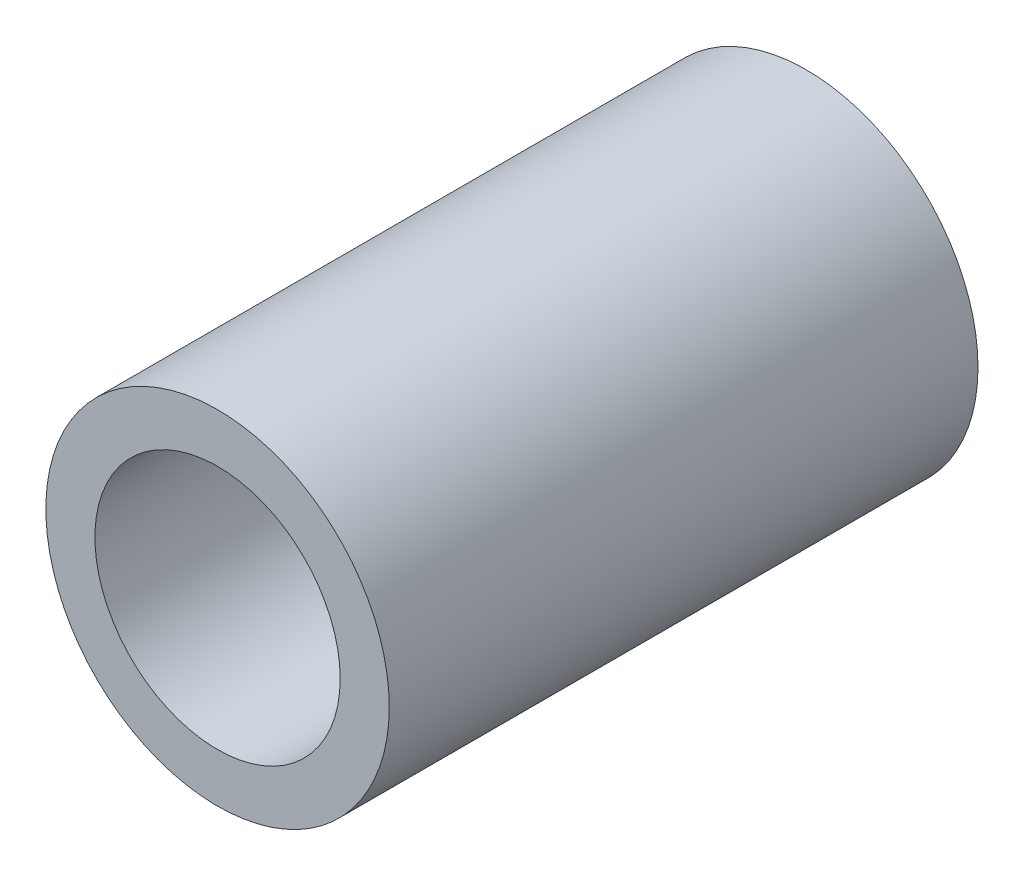
ISO-10303-21;
HEADER;
FILE_DESCRIPTION(('STEP AP214'),'2;1');
FILE_NAME('part.step','',(''),(''),'','','');
FILE_SCHEMA(('AUTOMOTIVE_DESIGN { 1 0 10303 214 1 1 1 1 }'));
ENDSEC;
DATA;
#1=APPLICATION_CONTEXT('core data for automotive mechanical design processes');
#2=APPLICATION_PROTOCOL_DEFINITION('international standard','automotive_design',2000,#1);
#3=PRODUCT_CONTEXT('',#1,'mechanical');
#4=PRODUCT('Part','Part','',(#3));
#5=PRODUCT_RELATED_PRODUCT_CATEGORY('part','',(#4));
#6=PRODUCT_DEFINITION_FORMATION('','',#4);
#7=PRODUCT_DEFINITION_CONTEXT('part definition',#1,'design');
#8=PRODUCT_DEFINITION('design','',#6,#7);
#9=PRODUCT_DEFINITION_SHAPE('','',#8);
#10=(LENGTH_UNIT() NAMED_UNIT(*) SI_UNIT(.MILLI.,.METRE.));
#11=(NAMED_UNIT(*) PLANE_ANGLE_UNIT() SI_UNIT($,.RADIAN.));
#12=(NAMED_UNIT(*) SI_UNIT($,.STERADIAN.) SOLID_ANGLE_UNIT());
#13=UNCERTAINTY_MEASURE_WITH_UNIT(LENGTH_MEASURE(1.E-05),#10,'distance_accuracy_value','');
#14=(GEOMETRIC_REPRESENTATION_CONTEXT(3) GLOBAL_UNCERTAINTY_ASSIGNED_CONTEXT((#13)) GLOBAL_UNIT_ASSIGNED_CONTEXT((#10,
#11,#12)) REPRESENTATION_CONTEXT('',''));
#15=CARTESIAN_POINT('',(0.,0.,0.));
#16=DIRECTION('',(0.,0.,1.));
#17=DIRECTION('',(1.,0.,0.));
#18=AXIS2_PLACEMENT_3D('',#15,#16,#17);
#19=CARTESIAN_POINT('',(0.,0.,10.));
#20=DIRECTION('',(0.,0.,1.));
#21=DIRECTION('',(1.,0.,0.));
#22=AXIS2_PLACEMENT_3D('',#19,#20,#21);
#23=PLANE('',#22);
#24=CARTESIAN_POINT('',(0.,0.,10.));
#25=DIRECTION('',(0.,0.,1.));
#26=DIRECTION('',(1.,0.,0.));
#27=AXIS2_PLACEMENT_3D('',#24,#25,#26);
#28=CIRCLE('',#27,20.);
#29=CARTESIAN_POINT('',(20.,0.,10.));
#30=VERTEX_POINT('',#29);
#31=EDGE_CURVE('E38',#30,#30,#28,.T.);
#32=ORIENTED_EDGE('',*,*,#31,.F.);
#33=EDGE_LOOP('',(#32));
#34=FACE_BOUND('',#33,.T.);
#35=CARTESIAN_POINT('',(0.,0.,10.));
#36=DIRECTION('',(0.,0.,1.));
#37=DIRECTION('',(1.,0.,0.));
#38=AXIS2_PLACEMENT_3D('',#35,#36,#37);
#39=CIRCLE('',#38,25.);
#40=CARTESIAN_POINT('',(25.,0.,10.));
#41=VERTEX_POINT('',#40);
#42=EDGE_CURVE('E52',#41,#41,#39,.T.);
#43=ORIENTED_EDGE('',*,*,#42,.T.);
#44=EDGE_LOOP('',(#43));
#45=FACE_BOUND('',#44,.T.);
#46=ADVANCED_FACE('F31',(#34,#45),#23,.T.);
#47=CARTESIAN_POINT('',(0.,0.,0.));
#48=DIRECTION('',(0.,0.,1.));
#49=DIRECTION('',(1.,0.,0.));
#50=AXIS2_PLACEMENT_3D('',#47,#48,#49);
#51=PLANE('',#50);
#52=CARTESIAN_POINT('',(0.,0.,0.));
#53=DIRECTION('',(0.,0.,1.));
#54=DIRECTION('',(1.,0.,0.));
#55=AXIS2_PLACEMENT_3D('',#52,#53,#54);
#56=CIRCLE('',#55,35.);
#57=CARTESIAN_POINT('',(35.,0.,0.));
#58=VERTEX_POINT('',#57);
#59=EDGE_CURVE('E10',#58,#58,#56,.T.);
#60=ORIENTED_EDGE('',*,*,#59,.F.);
#61=EDGE_LOOP('',(#60));
#62=FACE_BOUND('',#61,.T.);
#63=CARTESIAN_POINT('',(0.,0.,0.));
#64=DIRECTION('',(0.,0.,1.));
#65=DIRECTION('',(1.,0.,0.));
#66=AXIS2_PLACEMENT_3D('',#63,#64,#65);
#67=CIRCLE('',#66,20.);
#68=CARTESIAN_POINT('',(20.,0.,0.));
#69=VERTEX_POINT('',#68);
#70=EDGE_CURVE('E42',#69,#69,#67,.T.);
#71=ORIENTED_EDGE('',*,*,#70,.T.);
#72=EDGE_LOOP('',(#71));
#73=FACE_BOUND('',#72,.T.);
#74=ADVANCED_FACE('F73',(#62,#73),#51,.F.);
#75=CARTESIAN_POINT('',(0.,0.,10.));
#76=DIRECTION('',(0.,0.,-1.));
#77=DIRECTION('',(-1.,0.,0.));
#78=AXIS2_PLACEMENT_3D('',#75,#76,#77);
#79=CYLINDRICAL_SURFACE('',#78,35.);
#80=ORIENTED_EDGE('',*,*,#59,.T.);
#81=EDGE_LOOP('',(#80));
#82=FACE_BOUND('',#81,.T.);
#83=CARTESIAN_POINT('',(0.,0.,120.));
#84=DIRECTION('',(0.,0.,1.));
#85=DIRECTION('',(1.,0.,0.));
#86=AXIS2_PLACEMENT_3D('',#83,#84,#85);
#87=CIRCLE('',#86,35.);
#88=CARTESIAN_POINT('',(35.,0.,120.));
#89=VERTEX_POINT('',#88);
#90=EDGE_CURVE('E47',#89,#89,#87,.T.);
#91=ORIENTED_EDGE('',*,*,#90,.F.);
#92=EDGE_LOOP('',(#91));
#93=FACE_BOUND('',#92,.T.);
#94=ADVANCED_FACE('F33',(#82,#93),#79,.T.);
#95=CARTESIAN_POINT('',(0.,0.,10.));
#96=DIRECTION('',(0.,0.,-1.));
#97=DIRECTION('',(-1.,0.,0.));
#98=AXIS2_PLACEMENT_3D('',#95,#96,#97);
#99=CYLINDRICAL_SURFACE('',#98,20.);
#100=ORIENTED_EDGE('',*,*,#31,.T.);
#101=EDGE_LOOP('',(#100));
#102=FACE_BOUND('',#101,.T.);
#103=ORIENTED_EDGE('',*,*,#70,.F.);
#104=EDGE_LOOP('',(#103));
#105=FACE_BOUND('',#104,.T.);
#106=ADVANCED_FACE('F63',(#102,#105),#99,.F.);
#107=CARTESIAN_POINT('',(0.,0.,120.));
#108=DIRECTION('',(0.,0.,1.));
#109=DIRECTION('',(1.,0.,0.));
#110=AXIS2_PLACEMENT_3D('',#107,#108,#109);
#111=PLANE('',#110);
#112=ORIENTED_EDGE('',*,*,#90,.T.);
#113=EDGE_LOOP('',(#112));
#114=FACE_BOUND('',#113,.T.);
#115=CARTESIAN_POINT('',(0.,0.,120.));
#116=DIRECTION('',(0.,0.,1.));
#117=DIRECTION('',(1.,0.,0.));
#118=AXIS2_PLACEMENT_3D('',#115,#116,#117);
#119=CIRCLE('',#118,25.);
#120=CARTESIAN_POINT('',(25.,0.,120.));
#121=VERTEX_POINT('',#120);
#122=EDGE_CURVE('E51',#121,#121,#119,.T.);
#123=ORIENTED_EDGE('',*,*,#122,.F.);
#124=EDGE_LOOP('',(#123));
#125=FACE_BOUND('',#124,.T.);
#126=ADVANCED_FACE('F61',(#114,#125),#111,.T.);
#127=CARTESIAN_POINT('',(0.,0.,120.));
#128=DIRECTION('',(0.,0.,-1.));
#129=DIRECTION('',(-1.,0.,0.));
#130=AXIS2_PLACEMENT_3D('',#127,#128,#129);
#131=CYLINDRICAL_SURFACE('',#130,25.);
#132=ORIENTED_EDGE('',*,*,#122,.T.);
#133=EDGE_LOOP('',(#132));
#134=FACE_BOUND('',#133,.T.);
#135=ORIENTED_EDGE('',*,*,#42,.F.);
#136=EDGE_LOOP('',(#135));
#137=FACE_BOUND('',#136,.T.);
#138=ADVANCED_FACE('F58',(#134,#137),#131,.F.);
#139=CLOSED_SHELL('',(#46,#74,#94,#106,#126,#138));
#140=MANIFOLD_SOLID_BREP('B2',#139);
#141=ADVANCED_BREP_SHAPE_REPRESENTATION('',(#18,#140),#14);
#142=SHAPE_DEFINITION_REPRESENTATION(#9,#141);
ENDSEC;
END-ISO-10303-21;
